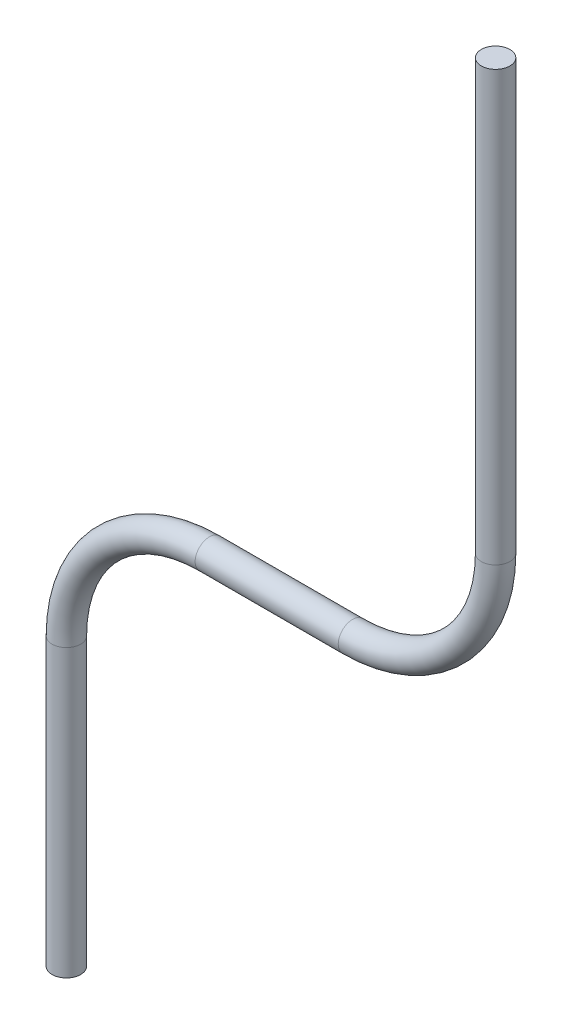
ISO-10303-21;
HEADER;
FILE_DESCRIPTION(('STEP AP214'),'2;1');
FILE_NAME('part.step','',(''),(''),'','','');
FILE_SCHEMA(('AUTOMOTIVE_DESIGN { 1 0 10303 214 1 1 1 1 }'));
ENDSEC;
DATA;
#1=APPLICATION_CONTEXT('core data for automotive mechanical design processes');
#2=APPLICATION_PROTOCOL_DEFINITION('international standard','automotive_design',2000,#1);
#3=PRODUCT_CONTEXT('',#1,'mechanical');
#4=PRODUCT('Part','Part','',(#3));
#5=PRODUCT_RELATED_PRODUCT_CATEGORY('part','',(#4));
#6=PRODUCT_DEFINITION_FORMATION('','',#4);
#7=PRODUCT_DEFINITION_CONTEXT('part definition',#1,'design');
#8=PRODUCT_DEFINITION('design','',#6,#7);
#9=PRODUCT_DEFINITION_SHAPE('','',#8);
#10=(LENGTH_UNIT() NAMED_UNIT(*) SI_UNIT(.MILLI.,.METRE.));
#11=(NAMED_UNIT(*) PLANE_ANGLE_UNIT() SI_UNIT($,.RADIAN.));
#12=(NAMED_UNIT(*) SI_UNIT($,.STERADIAN.) SOLID_ANGLE_UNIT());
#13=UNCERTAINTY_MEASURE_WITH_UNIT(LENGTH_MEASURE(1.E-05),#10,'distance_accuracy_value','');
#14=(GEOMETRIC_REPRESENTATION_CONTEXT(3) GLOBAL_UNCERTAINTY_ASSIGNED_CONTEXT((#13)) GLOBAL_UNIT_ASSIGNED_CONTEXT((#10,
#11,#12)) REPRESENTATION_CONTEXT('',''));
#15=CARTESIAN_POINT('',(0.,0.,0.));
#16=DIRECTION('',(0.,0.,1.));
#17=DIRECTION('',(1.,0.,0.));
#18=AXIS2_PLACEMENT_3D('',#15,#16,#17);
#19=CARTESIAN_POINT('',(0.,0.,0.));
#20=DIRECTION('',(0.,1.,0.));
#21=DIRECTION('',(0.,0.,1.));
#22=AXIS2_PLACEMENT_3D('',#19,#20,#21);
#23=PLANE('',#22);
#24=CARTESIAN_POINT('',(0.,0.,0.));
#25=DIRECTION('',(0.,1.,0.));
#26=DIRECTION('',(0.,0.,1.));
#27=AXIS2_PLACEMENT_3D('',#24,#25,#26);
#28=CIRCLE('',#27,1.);
#29=CARTESIAN_POINT('',(0.,0.,1.));
#30=VERTEX_POINT('',#29);
#31=EDGE_CURVE('E64',#30,#30,#28,.T.);
#32=ORIENTED_EDGE('',*,*,#31,.F.);
#33=EDGE_LOOP('',(#32));
#34=FACE_BOUND('',#33,.T.);
#35=ADVANCED_FACE('F37',(#34),#23,.F.);
#36=CARTESIAN_POINT('',(30.,70.,0.));
#37=DIRECTION('',(0.,1.,0.));
#38=DIRECTION('',(0.,0.,1.));
#39=AXIS2_PLACEMENT_3D('',#36,#37,#38);
#40=PLANE('',#39);
#41=CARTESIAN_POINT('',(30.,70.,0.));
#42=DIRECTION('',(0.,1.,0.));
#43=DIRECTION('',(0.,0.,1.));
#44=AXIS2_PLACEMENT_3D('',#41,#42,#43);
#45=CIRCLE('',#44,1.);
#46=CARTESIAN_POINT('',(30.,70.,1.));
#47=VERTEX_POINT('',#46);
#48=EDGE_CURVE('E10',#47,#47,#45,.T.);
#49=ORIENTED_EDGE('',*,*,#48,.T.);
#50=EDGE_LOOP('',(#49));
#51=FACE_BOUND('',#50,.T.);
#52=ADVANCED_FACE('F72',(#51),#40,.T.);
#53=CARTESIAN_POINT('',(0.,0.,0.));
#54=DIRECTION('',(0.,1.,0.));
#55=DIRECTION('',(0.,0.,1.));
#56=AXIS2_PLACEMENT_3D('',#53,#54,#55);
#57=CYLINDRICAL_SURFACE('',#56,1.);
#58=CARTESIAN_POINT('',(0.,19.9999999999999,0.));
#59=DIRECTION('',(0.,1.,0.));
#60=DIRECTION('',(0.,0.,1.));
#61=AXIS2_PLACEMENT_3D('',#58,#59,#60);
#62=CIRCLE('',#61,1.);
#63=CARTESIAN_POINT('',(-0.999999999999999,19.9999999999999,0.));
#64=VERTEX_POINT('',#63);
#65=EDGE_CURVE('E60',#64,#64,#62,.T.);
#66=ORIENTED_EDGE('',*,*,#65,.F.);
#67=EDGE_LOOP('',(#66));
#68=FACE_BOUND('',#67,.T.);
#69=ORIENTED_EDGE('',*,*,#31,.T.);
#70=EDGE_LOOP('',(#69));
#71=FACE_BOUND('',#70,.T.);
#72=ADVANCED_FACE('F69',(#68,#71),#57,.T.);
#73=CARTESIAN_POINT('',(10.,20.,0.));
#74=DIRECTION('',(0.,0.,-1.));
#75=DIRECTION('',(-1.,0.,0.));
#76=AXIS2_PLACEMENT_3D('',#73,#74,#75);
#77=TOROIDAL_SURFACE('',#76,10.,1.);
#78=CARTESIAN_POINT('',(10.0000000000001,30.,0.));
#79=DIRECTION('',(1.,0.,0.));
#80=DIRECTION('',(0.,0.,1.));
#81=AXIS2_PLACEMENT_3D('',#78,#79,#80);
#82=CIRCLE('',#81,1.);
#83=CARTESIAN_POINT('',(10.0000000000001,31.,0.));
#84=VERTEX_POINT('',#83);
#85=EDGE_CURVE('E54',#84,#84,#82,.T.);
#86=CARTESIAN_POINT('',(10.,20.,0.));
#87=DIRECTION('',(0.,0.,-1.));
#88=DIRECTION('',(-1.,0.,0.));
#89=AXIS2_PLACEMENT_3D('',#86,#87,#88);
#90=CIRCLE('',#89,11.);
#91=EDGE_CURVE('',#64,#84,#90,.T.);
#92=ORIENTED_EDGE('',*,*,#65,.T.);
#93=ORIENTED_EDGE('',*,*,#85,.F.);
#94=ORIENTED_EDGE('',*,*,#91,.T.);
#95=ORIENTED_EDGE('',*,*,#91,.F.);
#96=EDGE_LOOP('',(#92,#94,#93,#95));
#97=FACE_BOUND('',#96,.T.);
#98=ADVANCED_FACE('F90',(#97),#77,.T.);
#99=CARTESIAN_POINT('',(10.0000000000001,30.,0.));
#100=DIRECTION('',(1.,0.,0.));
#101=DIRECTION('',(0.,0.,-1.));
#102=AXIS2_PLACEMENT_3D('',#99,#100,#101);
#103=CYLINDRICAL_SURFACE('',#102,1.);
#104=CARTESIAN_POINT('',(19.9999999999999,30.,0.));
#105=DIRECTION('',(1.,0.,0.));
#106=DIRECTION('',(0.,0.,1.));
#107=AXIS2_PLACEMENT_3D('',#104,#105,#106);
#108=CIRCLE('',#107,1.);
#109=CARTESIAN_POINT('',(19.9999999999999,29.,0.));
#110=VERTEX_POINT('',#109);
#111=EDGE_CURVE('E49',#110,#110,#108,.T.);
#112=ORIENTED_EDGE('',*,*,#111,.F.);
#113=EDGE_LOOP('',(#112));
#114=FACE_BOUND('',#113,.T.);
#115=ORIENTED_EDGE('',*,*,#85,.T.);
#116=EDGE_LOOP('',(#115));
#117=FACE_BOUND('',#116,.T.);
#118=ADVANCED_FACE('F84',(#114,#117),#103,.T.);
#119=CARTESIAN_POINT('',(20.,40.,0.));
#120=DIRECTION('',(0.,0.,1.));
#121=DIRECTION('',(1.,0.,0.));
#122=AXIS2_PLACEMENT_3D('',#119,#120,#121);
#123=TOROIDAL_SURFACE('',#122,10.,1.);
#124=CARTESIAN_POINT('',(30.,40.,0.));
#125=DIRECTION('',(0.,1.,0.));
#126=DIRECTION('',(0.,0.,1.));
#127=AXIS2_PLACEMENT_3D('',#124,#125,#126);
#128=CIRCLE('',#127,1.);
#129=CARTESIAN_POINT('',(31.,40.,0.));
#130=VERTEX_POINT('',#129);
#131=EDGE_CURVE('E44',#130,#130,#128,.T.);
#132=CARTESIAN_POINT('',(20.,40.,0.));
#133=DIRECTION('',(0.,0.,1.));
#134=DIRECTION('',(1.,0.,0.));
#135=AXIS2_PLACEMENT_3D('',#132,#133,#134);
#136=CIRCLE('',#135,11.);
#137=EDGE_CURVE('',#110,#130,#136,.T.);
#138=ORIENTED_EDGE('',*,*,#111,.T.);
#139=ORIENTED_EDGE('',*,*,#131,.F.);
#140=ORIENTED_EDGE('',*,*,#137,.T.);
#141=ORIENTED_EDGE('',*,*,#137,.F.);
#142=EDGE_LOOP('',(#138,#140,#139,#141));
#143=FACE_BOUND('',#142,.T.);
#144=ADVANCED_FACE('F78',(#143),#123,.T.);
#145=CARTESIAN_POINT('',(30.,40.,0.));
#146=DIRECTION('',(0.,1.,0.));
#147=DIRECTION('',(0.,0.,1.));
#148=AXIS2_PLACEMENT_3D('',#145,#146,#147);
#149=CYLINDRICAL_SURFACE('',#148,1.);
#150=ORIENTED_EDGE('',*,*,#48,.F.);
#151=EDGE_LOOP('',(#150));
#152=FACE_BOUND('',#151,.T.);
#153=ORIENTED_EDGE('',*,*,#131,.T.);
#154=EDGE_LOOP('',(#153));
#155=FACE_BOUND('',#154,.T.);
#156=ADVANCED_FACE('F76',(#152,#155),#149,.T.);
#157=CLOSED_SHELL('',(#35,#52,#72,#98,#118,#144,#156));
#158=MANIFOLD_SOLID_BREP('B2',#157);
#159=ADVANCED_BREP_SHAPE_REPRESENTATION('',(#18,#158),#14);
#160=SHAPE_DEFINITION_REPRESENTATION(#9,#159);
ENDSEC;
END-ISO-10303-21;
